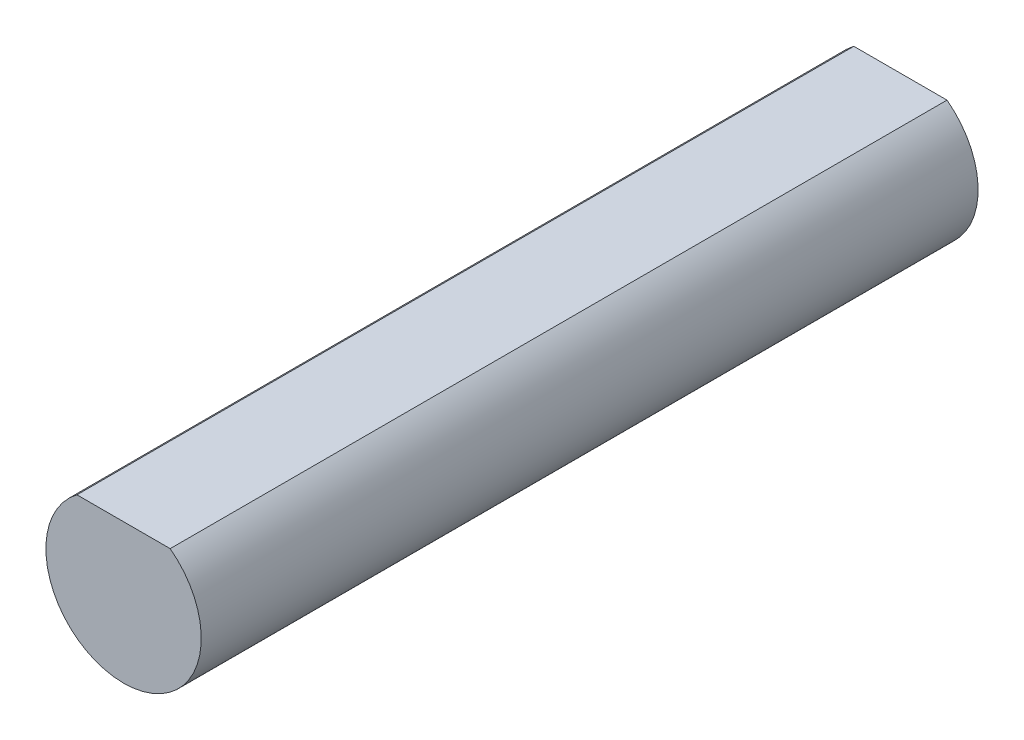
ISO-10303-21;
HEADER;
FILE_DESCRIPTION(('STEP AP214'),'2;1');
FILE_NAME('part.step','',(''),(''),'','','');
FILE_SCHEMA(('AUTOMOTIVE_DESIGN { 1 0 10303 214 1 1 1 1 }'));
ENDSEC;
DATA;
#1=APPLICATION_CONTEXT('core data for automotive mechanical design processes');
#2=APPLICATION_PROTOCOL_DEFINITION('international standard','automotive_design',2000,#1);
#3=PRODUCT_CONTEXT('',#1,'mechanical');
#4=PRODUCT('Part','Part','',(#3));
#5=PRODUCT_RELATED_PRODUCT_CATEGORY('part','',(#4));
#6=PRODUCT_DEFINITION_FORMATION('','',#4);
#7=PRODUCT_DEFINITION_CONTEXT('part definition',#1,'design');
#8=PRODUCT_DEFINITION('design','',#6,#7);
#9=PRODUCT_DEFINITION_SHAPE('','',#8);
#10=(LENGTH_UNIT() NAMED_UNIT(*) SI_UNIT(.MILLI.,.METRE.));
#11=(NAMED_UNIT(*) PLANE_ANGLE_UNIT() SI_UNIT($,.RADIAN.));
#12=(NAMED_UNIT(*) SI_UNIT($,.STERADIAN.) SOLID_ANGLE_UNIT());
#13=UNCERTAINTY_MEASURE_WITH_UNIT(LENGTH_MEASURE(1.E-05),#10,'distance_accuracy_value','');
#14=(GEOMETRIC_REPRESENTATION_CONTEXT(3) GLOBAL_UNCERTAINTY_ASSIGNED_CONTEXT((#13)) GLOBAL_UNIT_ASSIGNED_CONTEXT((#10,
#11,#12)) REPRESENTATION_CONTEXT('',''));
#15=CARTESIAN_POINT('',(0.,0.,0.));
#16=DIRECTION('',(0.,0.,1.));
#17=DIRECTION('',(1.,0.,0.));
#18=AXIS2_PLACEMENT_3D('',#15,#16,#17);
#19=CARTESIAN_POINT('',(0.,2.,25.));
#20=DIRECTION('',(0.,1.,0.));
#21=DIRECTION('',(-1.,0.,0.));
#22=AXIS2_PLACEMENT_3D('',#19,#20,#21);
#23=PLANE('',#22);
#24=DIRECTION('',(1.,0.,0.));
#25=VECTOR('',#24,1.);
#26=CARTESIAN_POINT('',(0.,2.,0.));
#27=LINE('',#26,#25);
#28=CARTESIAN_POINT('',(-1.5,2.,0.));
#29=VERTEX_POINT('',#28);
#30=CARTESIAN_POINT('',(1.5,2.,0.));
#31=VERTEX_POINT('',#30);
#32=EDGE_CURVE('E63',#29,#31,#27,.T.);
#33=ORIENTED_EDGE('',*,*,#32,.F.);
#34=DIRECTION('',(0.,0.,-1.));
#35=VECTOR('',#34,1.);
#36=CARTESIAN_POINT('',(-1.5,2.,25.));
#37=LINE('',#36,#35);
#38=CARTESIAN_POINT('',(-1.5,2.,25.));
#39=VERTEX_POINT('',#38);
#40=EDGE_CURVE('E11',#39,#29,#37,.T.);
#41=ORIENTED_EDGE('',*,*,#40,.F.);
#42=DIRECTION('',(1.,0.,0.));
#43=VECTOR('',#42,1.);
#44=CARTESIAN_POINT('',(0.,2.,25.));
#45=LINE('',#44,#43);
#46=CARTESIAN_POINT('',(1.5,2.,25.));
#47=VERTEX_POINT('',#46);
#48=EDGE_CURVE('E64',#39,#47,#45,.T.);
#49=ORIENTED_EDGE('',*,*,#48,.T.);
#50=DIRECTION('',(0.,0.,-1.));
#51=VECTOR('',#50,1.);
#52=CARTESIAN_POINT('',(1.5,2.,25.));
#53=LINE('',#52,#51);
#54=EDGE_CURVE('E43',#47,#31,#53,.T.);
#55=ORIENTED_EDGE('',*,*,#54,.T.);
#56=EDGE_LOOP('',(#33,#41,#49,#55));
#57=FACE_BOUND('',#56,.T.);
#58=ADVANCED_FACE('F35',(#57),#23,.T.);
#59=CARTESIAN_POINT('',(0.,0.,25.));
#60=DIRECTION('',(0.,0.,-1.));
#61=DIRECTION('',(-1.,0.,0.));
#62=AXIS2_PLACEMENT_3D('',#59,#60,#61);
#63=CYLINDRICAL_SURFACE('',#62,2.5);
#64=CARTESIAN_POINT('',(0.,0.,0.));
#65=DIRECTION('',(0.,0.,1.));
#66=DIRECTION('',(1.,0.,0.));
#67=AXIS2_PLACEMENT_3D('',#64,#65,#66);
#68=CIRCLE('',#67,2.5);
#69=EDGE_CURVE('E65',#29,#31,#68,.T.);
#70=ORIENTED_EDGE('',*,*,#69,.T.);
#71=ORIENTED_EDGE('',*,*,#54,.F.);
#72=CARTESIAN_POINT('',(0.,0.,25.));
#73=DIRECTION('',(0.,0.,1.));
#74=DIRECTION('',(1.,0.,0.));
#75=AXIS2_PLACEMENT_3D('',#72,#73,#74);
#76=CIRCLE('',#75,2.5);
#77=EDGE_CURVE('E50',#39,#47,#76,.T.);
#78=ORIENTED_EDGE('',*,*,#77,.F.);
#79=ORIENTED_EDGE('',*,*,#40,.T.);
#80=EDGE_LOOP('',(#70,#71,#78,#79));
#81=FACE_BOUND('',#80,.T.);
#82=ADVANCED_FACE('F66',(#81),#63,.T.);
#83=CARTESIAN_POINT('',(0.,0.,25.));
#84=DIRECTION('',(0.,0.,1.));
#85=DIRECTION('',(1.,0.,0.));
#86=AXIS2_PLACEMENT_3D('',#83,#84,#85);
#87=PLANE('',#86);
#88=ORIENTED_EDGE('',*,*,#48,.F.);
#89=ORIENTED_EDGE('',*,*,#77,.T.);
#90=EDGE_LOOP('',(#88,#89));
#91=FACE_BOUND('',#90,.T.);
#92=ADVANCED_FACE('F74',(#91),#87,.T.);
#93=CARTESIAN_POINT('',(0.,0.,0.));
#94=DIRECTION('',(0.,0.,1.));
#95=DIRECTION('',(1.,0.,0.));
#96=AXIS2_PLACEMENT_3D('',#93,#94,#95);
#97=PLANE('',#96);
#98=ORIENTED_EDGE('',*,*,#32,.T.);
#99=ORIENTED_EDGE('',*,*,#69,.F.);
#100=EDGE_LOOP('',(#98,#99));
#101=FACE_BOUND('',#100,.T.);
#102=ADVANCED_FACE('F69',(#101),#97,.F.);
#103=CLOSED_SHELL('',(#58,#82,#92,#102));
#104=MANIFOLD_SOLID_BREP('B2',#103);
#105=ADVANCED_BREP_SHAPE_REPRESENTATION('',(#18,#104),#14);
#106=SHAPE_DEFINITION_REPRESENTATION(#9,#105);
ENDSEC;
END-ISO-10303-21;
